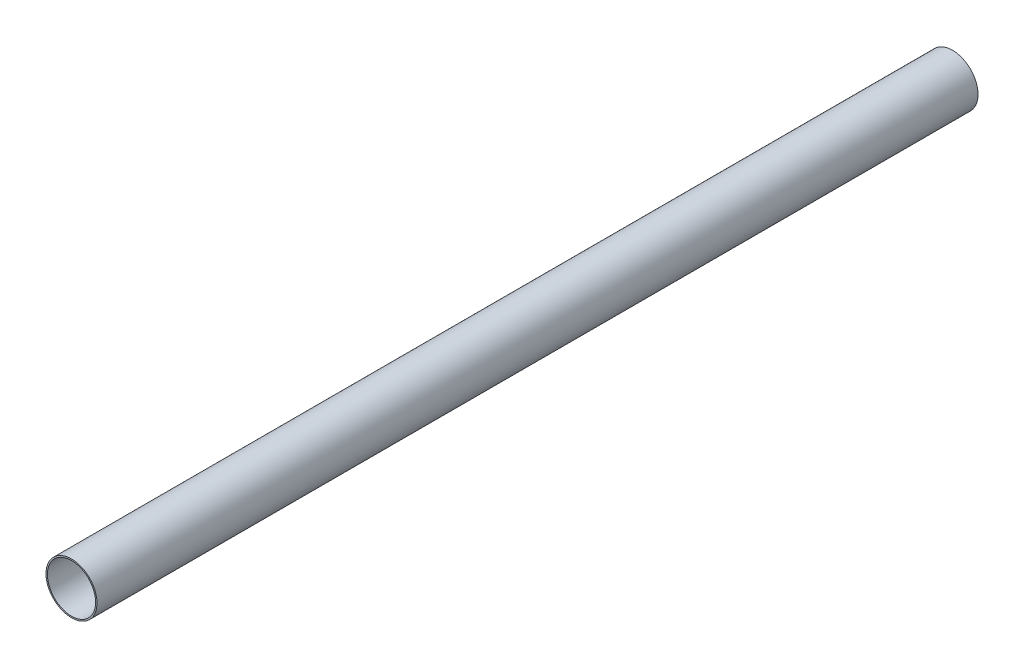
ISO-10303-21;
HEADER;
FILE_DESCRIPTION(('STEP AP214'),'2;1');
FILE_NAME('part.step','',(''),(''),'','','');
FILE_SCHEMA(('AUTOMOTIVE_DESIGN { 1 0 10303 214 1 1 1 1 }'));
ENDSEC;
DATA;
#1=APPLICATION_CONTEXT('core data for automotive mechanical design processes');
#2=APPLICATION_PROTOCOL_DEFINITION('international standard','automotive_design',2000,#1);
#3=PRODUCT_CONTEXT('',#1,'mechanical');
#4=PRODUCT('Part','Part','',(#3));
#5=PRODUCT_RELATED_PRODUCT_CATEGORY('part','',(#4));
#6=PRODUCT_DEFINITION_FORMATION('','',#4);
#7=PRODUCT_DEFINITION_CONTEXT('part definition',#1,'design');
#8=PRODUCT_DEFINITION('design','',#6,#7);
#9=PRODUCT_DEFINITION_SHAPE('','',#8);
#10=(LENGTH_UNIT() NAMED_UNIT(*) SI_UNIT(.MILLI.,.METRE.));
#11=(NAMED_UNIT(*) PLANE_ANGLE_UNIT() SI_UNIT($,.RADIAN.));
#12=(NAMED_UNIT(*) SI_UNIT($,.STERADIAN.) SOLID_ANGLE_UNIT());
#13=UNCERTAINTY_MEASURE_WITH_UNIT(LENGTH_MEASURE(1.E-05),#10,'distance_accuracy_value','');
#14=(GEOMETRIC_REPRESENTATION_CONTEXT(3) GLOBAL_UNCERTAINTY_ASSIGNED_CONTEXT((#13)) GLOBAL_UNIT_ASSIGNED_CONTEXT((#10,
#11,#12)) REPRESENTATION_CONTEXT('',''));
#15=CARTESIAN_POINT('',(0.,0.,0.));
#16=DIRECTION('',(0.,0.,1.));
#17=DIRECTION('',(1.,0.,0.));
#18=AXIS2_PLACEMENT_3D('',#15,#16,#17);
#19=CARTESIAN_POINT('',(0.,0.,1900.));
#20=DIRECTION('',(0.,0.,-1.));
#21=DIRECTION('',(-1.,0.,0.));
#22=AXIS2_PLACEMENT_3D('',#19,#20,#21);
#23=CYLINDRICAL_SURFACE('',#22,55.);
#24=CARTESIAN_POINT('',(0.,0.,1900.));
#25=DIRECTION('',(0.,0.,1.));
#26=DIRECTION('',(1.,0.,0.));
#27=AXIS2_PLACEMENT_3D('',#24,#25,#26);
#28=CIRCLE('',#27,55.);
#29=CARTESIAN_POINT('',(-55.,0.,1900.));
#30=VERTEX_POINT('',#29);
#31=EDGE_CURVE('E10',#30,#30,#28,.T.);
#32=CARTESIAN_POINT('',(0.,0.,0.));
#33=DIRECTION('',(0.,0.,1.));
#34=DIRECTION('',(1.,0.,0.));
#35=AXIS2_PLACEMENT_3D('',#32,#33,#34);
#36=CIRCLE('',#35,55.);
#37=CARTESIAN_POINT('',(-55.,0.,-2.22044604925031E-13));
#38=VERTEX_POINT('',#37);
#39=EDGE_CURVE('E35',#38,#38,#36,.T.);
#40=CARTESIAN_POINT('',(-55.,0.,1900.));
#41=CARTESIAN_POINT('',(-55.,0.,1880.20833333333));
#42=CARTESIAN_POINT('',(-55.,0.,1860.41666666667));
#43=CARTESIAN_POINT('',(-55.,0.,1820.83333333333));
#44=CARTESIAN_POINT('',(-55.,0.,1801.04166666667));
#45=CARTESIAN_POINT('',(-55.,0.,1761.45833333333));
#46=CARTESIAN_POINT('',(-55.,0.,1741.66666666667));
#47=CARTESIAN_POINT('',(-55.,0.,1702.08333333333));
#48=CARTESIAN_POINT('',(-55.,0.,1682.29166666667));
#49=CARTESIAN_POINT('',(-55.,0.,1642.70833333333));
#50=CARTESIAN_POINT('',(-55.,0.,1622.91666666667));
#51=CARTESIAN_POINT('',(-55.,0.,1583.33333333333));
#52=CARTESIAN_POINT('',(-55.,0.,1563.54166666667));
#53=CARTESIAN_POINT('',(-55.,0.,1523.95833333333));
#54=CARTESIAN_POINT('',(-55.,0.,1504.16666666667));
#55=CARTESIAN_POINT('',(-55.,0.,1464.58333333333));
#56=CARTESIAN_POINT('',(-55.,0.,1444.79166666667));
#57=CARTESIAN_POINT('',(-55.,0.,1405.20833333333));
#58=CARTESIAN_POINT('',(-55.,0.,1385.41666666667));
#59=CARTESIAN_POINT('',(-55.,0.,1345.83333333333));
#60=CARTESIAN_POINT('',(-55.,0.,1326.04166666667));
#61=CARTESIAN_POINT('',(-55.,0.,1286.45833333333));
#62=CARTESIAN_POINT('',(-55.,0.,1266.66666666667));
#63=CARTESIAN_POINT('',(-55.,0.,1227.08333333333));
#64=CARTESIAN_POINT('',(-55.,0.,1207.29166666667));
#65=CARTESIAN_POINT('',(-55.,0.,1167.70833333333));
#66=CARTESIAN_POINT('',(-55.,0.,1147.91666666667));
#67=CARTESIAN_POINT('',(-55.,0.,1108.33333333333));
#68=CARTESIAN_POINT('',(-55.,0.,1088.54166666667));
#69=CARTESIAN_POINT('',(-55.,0.,1048.95833333333));
#70=CARTESIAN_POINT('',(-55.,0.,1029.16666666667));
#71=CARTESIAN_POINT('',(-55.,0.,989.583333333333));
#72=CARTESIAN_POINT('',(-55.,0.,969.791666666666));
#73=CARTESIAN_POINT('',(-55.,0.,930.208333333333));
#74=CARTESIAN_POINT('',(-55.,0.,910.416666666667));
#75=CARTESIAN_POINT('',(-55.,0.,870.833333333333));
#76=CARTESIAN_POINT('',(-55.,0.,851.041666666667));
#77=CARTESIAN_POINT('',(-55.,0.,811.458333333333));
#78=CARTESIAN_POINT('',(-55.,0.,791.666666666667));
#79=CARTESIAN_POINT('',(-55.,0.,752.083333333333));
#80=CARTESIAN_POINT('',(-55.,0.,732.291666666667));
#81=CARTESIAN_POINT('',(-55.,0.,692.708333333333));
#82=CARTESIAN_POINT('',(-55.,0.,672.916666666667));
#83=CARTESIAN_POINT('',(-55.,0.,633.333333333333));
#84=CARTESIAN_POINT('',(-55.,0.,613.541666666667));
#85=CARTESIAN_POINT('',(-55.,0.,573.958333333333));
#86=CARTESIAN_POINT('',(-55.,0.,554.166666666667));
#87=CARTESIAN_POINT('',(-55.,0.,514.583333333333));
#88=CARTESIAN_POINT('',(-55.,0.,494.791666666667));
#89=CARTESIAN_POINT('',(-55.,0.,455.208333333333));
#90=CARTESIAN_POINT('',(-55.,0.,435.416666666667));
#91=CARTESIAN_POINT('',(-55.,0.,395.833333333333));
#92=CARTESIAN_POINT('',(-55.,0.,376.041666666667));
#93=CARTESIAN_POINT('',(-55.,0.,336.458333333333));
#94=CARTESIAN_POINT('',(-55.,0.,316.666666666666));
#95=CARTESIAN_POINT('',(-55.,0.,277.083333333333));
#96=CARTESIAN_POINT('',(-55.,0.,257.291666666666));
#97=CARTESIAN_POINT('',(-55.,0.,217.708333333333));
#98=CARTESIAN_POINT('',(-55.,0.,197.916666666667));
#99=CARTESIAN_POINT('',(-55.,0.,158.333333333333));
#100=CARTESIAN_POINT('',(-55.,0.,138.541666666666));
#101=CARTESIAN_POINT('',(-55.,0.,98.958333333333));
#102=CARTESIAN_POINT('',(-55.,0.,79.1666666666664));
#103=CARTESIAN_POINT('',(-55.,0.,39.5833333333331));
#104=CARTESIAN_POINT('',(-55.,0.,19.7916666666664));
#105=CARTESIAN_POINT('',(-55.,0.,-2.22044604925031E-13));
#106=B_SPLINE_CURVE_WITH_KNOTS('',3,(#40,#41,#42,#43,#44,#45,#46,#47,#48,#49,#50,#51,#52,#53,
#54,#55,#56,#57,#58,#59,#60,#61,#62,#63,#64,#65,#66,#67,#68,#69,#70,#71,#72,#73,#74,#75,#76,#77,
#78,#79,#80,#81,#82,#83,#84,#85,#86,#87,#88,#89,#90,#91,#92,#93,#94,#95,#96,#97,#98,#99,#100,
#101,#102,#103,#104,#105),.UNSPECIFIED.,.F.,.F.,(4,2,2,2,2,2,2,2,2,2,2,2,2,2,2,2,2,2,2,2,2,2,2,
2,2,2,2,2,2,2,2,2,4),(0.,59.3750000000002,118.75,178.125,237.5,296.875,356.25,415.625,475.,
534.375,593.75,653.125,712.5,771.875,831.25,890.625,950.,1009.375,1068.75,1128.125,1187.5,
1246.875,1306.25,1365.625,1425.,1484.375,1543.75,1603.125,1662.5,1721.875,1781.25,1840.625,
1900.),.UNSPECIFIED.);
#107=EDGE_CURVE('BSEAM32',#30,#38,#106,.T.);
#108=ORIENTED_EDGE('',*,*,#31,.F.);
#109=ORIENTED_EDGE('',*,*,#39,.T.);
#110=ORIENTED_EDGE('',*,*,#107,.T.);
#111=ORIENTED_EDGE('',*,*,#107,.F.);
#112=EDGE_LOOP('',(#108,#110,#109,#111));
#113=FACE_BOUND('',#112,.T.);
#114=ADVANCED_FACE('F32',(#113),#23,.T.);
#115=CARTESIAN_POINT('',(0.,0.,1900.));
#116=DIRECTION('',(0.,0.,1.));
#117=DIRECTION('',(1.,0.,0.));
#118=AXIS2_PLACEMENT_3D('',#115,#116,#117);
#119=PLANE('',#118);
#120=CARTESIAN_POINT('',(0.,0.,1900.));
#121=DIRECTION('',(0.,0.,1.));
#122=DIRECTION('',(1.,0.,0.));
#123=AXIS2_PLACEMENT_3D('',#120,#121,#122);
#124=CIRCLE('',#123,52.);
#125=CARTESIAN_POINT('',(-52.,0.,1900.));
#126=VERTEX_POINT('',#125);
#127=EDGE_CURVE('E42',#126,#126,#124,.T.);
#128=ORIENTED_EDGE('',*,*,#127,.F.);
#129=EDGE_LOOP('',(#128));
#130=FACE_BOUND('',#129,.T.);
#131=ORIENTED_EDGE('',*,*,#31,.T.);
#132=EDGE_LOOP('',(#131));
#133=FACE_BOUND('',#132,.T.);
#134=ADVANCED_FACE('F53',(#130,#133),#119,.T.);
#135=CARTESIAN_POINT('',(0.,0.,0.));
#136=DIRECTION('',(0.,0.,1.));
#137=DIRECTION('',(1.,0.,0.));
#138=AXIS2_PLACEMENT_3D('',#135,#136,#137);
#139=PLANE('',#138);
#140=CARTESIAN_POINT('',(0.,0.,0.));
#141=DIRECTION('',(0.,0.,1.));
#142=DIRECTION('',(1.,0.,0.));
#143=AXIS2_PLACEMENT_3D('',#140,#141,#142);
#144=CIRCLE('',#143,52.);
#145=CARTESIAN_POINT('',(-52.,0.,-2.22044604925031E-13));
#146=VERTEX_POINT('',#145);
#147=EDGE_CURVE('E44',#146,#146,#144,.T.);
#148=ORIENTED_EDGE('',*,*,#147,.T.);
#149=EDGE_LOOP('',(#148));
#150=FACE_BOUND('',#149,.T.);
#151=ORIENTED_EDGE('',*,*,#39,.F.);
#152=EDGE_LOOP('',(#151));
#153=FACE_BOUND('',#152,.T.);
#154=ADVANCED_FACE('F55',(#150,#153),#139,.F.);
#155=CARTESIAN_POINT('',(0.,0.,1900.));
#156=DIRECTION('',(0.,0.,-1.));
#157=DIRECTION('',(-1.,0.,0.));
#158=AXIS2_PLACEMENT_3D('',#155,#156,#157);
#159=CYLINDRICAL_SURFACE('',#158,52.);
#160=CARTESIAN_POINT('',(-52.,0.,1900.));
#161=CARTESIAN_POINT('',(-52.,0.,1880.20833333333));
#162=CARTESIAN_POINT('',(-52.,0.,1860.41666666667));
#163=CARTESIAN_POINT('',(-52.,0.,1820.83333333333));
#164=CARTESIAN_POINT('',(-52.,0.,1801.04166666667));
#165=CARTESIAN_POINT('',(-52.,0.,1761.45833333333));
#166=CARTESIAN_POINT('',(-52.,0.,1741.66666666667));
#167=CARTESIAN_POINT('',(-52.,0.,1702.08333333333));
#168=CARTESIAN_POINT('',(-52.,0.,1682.29166666667));
#169=CARTESIAN_POINT('',(-52.,0.,1642.70833333333));
#170=CARTESIAN_POINT('',(-52.,0.,1622.91666666667));
#171=CARTESIAN_POINT('',(-52.,0.,1583.33333333333));
#172=CARTESIAN_POINT('',(-52.,0.,1563.54166666667));
#173=CARTESIAN_POINT('',(-52.,0.,1523.95833333333));
#174=CARTESIAN_POINT('',(-52.,0.,1504.16666666667));
#175=CARTESIAN_POINT('',(-52.,0.,1464.58333333333));
#176=CARTESIAN_POINT('',(-52.,0.,1444.79166666667));
#177=CARTESIAN_POINT('',(-52.,0.,1405.20833333333));
#178=CARTESIAN_POINT('',(-52.,0.,1385.41666666667));
#179=CARTESIAN_POINT('',(-52.,0.,1345.83333333333));
#180=CARTESIAN_POINT('',(-52.,0.,1326.04166666667));
#181=CARTESIAN_POINT('',(-52.,0.,1286.45833333333));
#182=CARTESIAN_POINT('',(-52.,0.,1266.66666666667));
#183=CARTESIAN_POINT('',(-52.,0.,1227.08333333333));
#184=CARTESIAN_POINT('',(-52.,0.,1207.29166666667));
#185=CARTESIAN_POINT('',(-52.,0.,1167.70833333333));
#186=CARTESIAN_POINT('',(-52.,0.,1147.91666666667));
#187=CARTESIAN_POINT('',(-52.,0.,1108.33333333333));
#188=CARTESIAN_POINT('',(-52.,0.,1088.54166666667));
#189=CARTESIAN_POINT('',(-52.,0.,1048.95833333333));
#190=CARTESIAN_POINT('',(-52.,0.,1029.16666666667));
#191=CARTESIAN_POINT('',(-52.,0.,989.583333333333));
#192=CARTESIAN_POINT('',(-52.,0.,969.791666666666));
#193=CARTESIAN_POINT('',(-52.,0.,930.208333333333));
#194=CARTESIAN_POINT('',(-52.,0.,910.416666666667));
#195=CARTESIAN_POINT('',(-52.,0.,870.833333333333));
#196=CARTESIAN_POINT('',(-52.,0.,851.041666666667));
#197=CARTESIAN_POINT('',(-52.,0.,811.458333333333));
#198=CARTESIAN_POINT('',(-52.,0.,791.666666666667));
#199=CARTESIAN_POINT('',(-52.,0.,752.083333333333));
#200=CARTESIAN_POINT('',(-52.,0.,732.291666666667));
#201=CARTESIAN_POINT('',(-52.,0.,692.708333333333));
#202=CARTESIAN_POINT('',(-52.,0.,672.916666666667));
#203=CARTESIAN_POINT('',(-52.,0.,633.333333333333));
#204=CARTESIAN_POINT('',(-52.,0.,613.541666666667));
#205=CARTESIAN_POINT('',(-52.,0.,573.958333333333));
#206=CARTESIAN_POINT('',(-52.,0.,554.166666666667));
#207=CARTESIAN_POINT('',(-52.,0.,514.583333333333));
#208=CARTESIAN_POINT('',(-52.,0.,494.791666666667));
#209=CARTESIAN_POINT('',(-52.,0.,455.208333333333));
#210=CARTESIAN_POINT('',(-52.,0.,435.416666666667));
#211=CARTESIAN_POINT('',(-52.,0.,395.833333333333));
#212=CARTESIAN_POINT('',(-52.,0.,376.041666666667));
#213=CARTESIAN_POINT('',(-52.,0.,336.458333333333));
#214=CARTESIAN_POINT('',(-52.,0.,316.666666666666));
#215=CARTESIAN_POINT('',(-52.,0.,277.083333333333));
#216=CARTESIAN_POINT('',(-52.,0.,257.291666666666));
#217=CARTESIAN_POINT('',(-52.,0.,217.708333333333));
#218=CARTESIAN_POINT('',(-52.,0.,197.916666666667));
#219=CARTESIAN_POINT('',(-52.,0.,158.333333333333));
#220=CARTESIAN_POINT('',(-52.,0.,138.541666666666));
#221=CARTESIAN_POINT('',(-52.,0.,98.958333333333));
#222=CARTESIAN_POINT('',(-52.,0.,79.1666666666664));
#223=CARTESIAN_POINT('',(-52.,0.,39.5833333333331));
#224=CARTESIAN_POINT('',(-52.,0.,19.7916666666664));
#225=CARTESIAN_POINT('',(-52.,0.,-2.22044604925031E-13));
#226=B_SPLINE_CURVE_WITH_KNOTS('',3,(#160,#161,#162,#163,#164,#165,#166,#167,#168,#169,#170,
#171,#172,#173,#174,#175,#176,#177,#178,#179,#180,#181,#182,#183,#184,#185,#186,#187,#188,#189,
#190,#191,#192,#193,#194,#195,#196,#197,#198,#199,#200,#201,#202,#203,#204,#205,#206,#207,#208,
#209,#210,#211,#212,#213,#214,#215,#216,#217,#218,#219,#220,#221,#222,#223,#224,#225),
.UNSPECIFIED.,.F.,.F.,(4,2,2,2,2,2,2,2,2,2,2,2,2,2,2,2,2,2,2,2,2,2,2,2,2,2,2,2,2,2,2,2,4),(0.,
59.3750000000002,118.75,178.125,237.5,296.875,356.25,415.625,475.,534.375,593.75,653.125,712.5,
771.875,831.25,890.625,950.,1009.375,1068.75,1128.125,1187.5,1246.875,1306.25,1365.625,1425.,
1484.375,1543.75,1603.125,1662.5,1721.875,1781.25,1840.625,1900.),.UNSPECIFIED.);
#227=EDGE_CURVE('BSEAM50',#126,#146,#226,.T.);
#228=ORIENTED_EDGE('',*,*,#127,.T.);
#229=ORIENTED_EDGE('',*,*,#147,.F.);
#230=ORIENTED_EDGE('',*,*,#227,.T.);
#231=ORIENTED_EDGE('',*,*,#227,.F.);
#232=EDGE_LOOP('',(#228,#230,#229,#231));
#233=FACE_BOUND('',#232,.T.);
#234=ADVANCED_FACE('F50',(#233),#159,.F.);
#235=CLOSED_SHELL('',(#114,#134,#154,#234));
#236=MANIFOLD_SOLID_BREP('B2',#235);
#237=ADVANCED_BREP_SHAPE_REPRESENTATION('',(#18,#236),#14);
#238=SHAPE_DEFINITION_REPRESENTATION(#9,#237);
ENDSEC;
END-ISO-10303-21;
